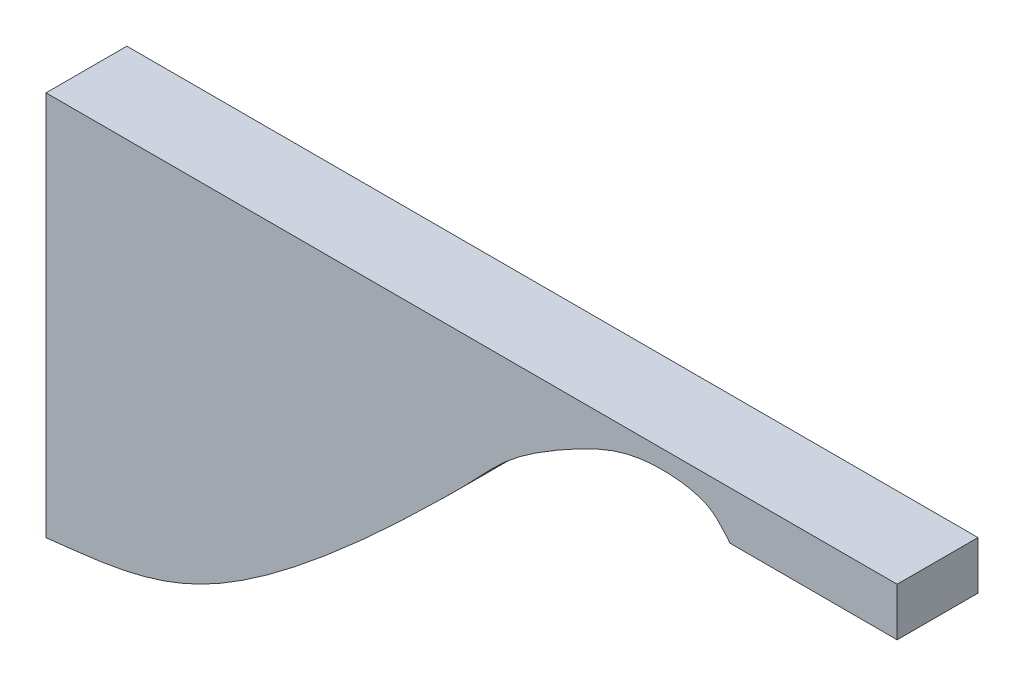
ISO-10303-21;
HEADER;
FILE_DESCRIPTION(('STEP AP214'),'2;1');
FILE_NAME('part.step','',(''),(''),'','','');
FILE_SCHEMA(('AUTOMOTIVE_DESIGN { 1 0 10303 214 1 1 1 1 }'));
ENDSEC;
DATA;
#1=APPLICATION_CONTEXT('core data for automotive mechanical design processes');
#2=APPLICATION_PROTOCOL_DEFINITION('international standard','automotive_design',2000,#1);
#3=PRODUCT_CONTEXT('',#1,'mechanical');
#4=PRODUCT('Part','Part','',(#3));
#5=PRODUCT_RELATED_PRODUCT_CATEGORY('part','',(#4));
#6=PRODUCT_DEFINITION_FORMATION('','',#4);
#7=PRODUCT_DEFINITION_CONTEXT('part definition',#1,'design');
#8=PRODUCT_DEFINITION('design','',#6,#7);
#9=PRODUCT_DEFINITION_SHAPE('','',#8);
#10=(LENGTH_UNIT() NAMED_UNIT(*) SI_UNIT(.MILLI.,.METRE.));
#11=(NAMED_UNIT(*) PLANE_ANGLE_UNIT() SI_UNIT($,.RADIAN.));
#12=(NAMED_UNIT(*) SI_UNIT($,.STERADIAN.) SOLID_ANGLE_UNIT());
#13=UNCERTAINTY_MEASURE_WITH_UNIT(LENGTH_MEASURE(1.E-05),#10,'distance_accuracy_value','');
#14=(GEOMETRIC_REPRESENTATION_CONTEXT(3) GLOBAL_UNCERTAINTY_ASSIGNED_CONTEXT((#13)) GLOBAL_UNIT_ASSIGNED_CONTEXT((#10,
#11,#12)) REPRESENTATION_CONTEXT('',''));
#15=CARTESIAN_POINT('',(0.,0.,0.));
#16=DIRECTION('',(0.,0.,1.));
#17=DIRECTION('',(1.,0.,0.));
#18=AXIS2_PLACEMENT_3D('',#15,#16,#17);
#19=CARTESIAN_POINT('',(32.3540093546962,-35.8630234783665,67.9999999999997));
#20=CARTESIAN_POINT('',(32.6330788083493,-35.831174871455,67.9999999999997));
#21=CARTESIAN_POINT('',(33.2024338177118,-35.7661976278013,67.9999999999997));
#22=CARTESIAN_POINT('',(34.1969972226958,-35.6557091477707,67.9999999999997));
#23=CARTESIAN_POINT('',(35.4101941899744,-35.5193217190211,67.9999999999997));
#24=CARTESIAN_POINT('',(36.7926440722978,-35.3496312045826,67.9999999999997));
#25=CARTESIAN_POINT('',(38.2076962127767,-35.1467983323149,67.9999999999997));
#26=CARTESIAN_POINT('',(40.0387210193549,-34.8311247311899,67.9999999999997));
#27=CARTESIAN_POINT('',(42.2959361043447,-34.3129106992321,67.9999999999997));
#28=CARTESIAN_POINT('',(44.9212362035922,-33.4463756729505,67.9999999999997));
#29=CARTESIAN_POINT('',(47.4363913704997,-32.3443886947765,67.9999999999997));
#30=CARTESIAN_POINT('',(49.8462344698793,-31.0379045520908,67.9999999999997));
#31=CARTESIAN_POINT('',(52.1560834937112,-29.5821742950078,67.9999999999997));
#32=CARTESIAN_POINT('',(54.4170811616657,-28.0016088025287,67.9999999999997));
#33=CARTESIAN_POINT('',(57.3541623503401,-25.7813889640924,67.9999999999997));
#34=CARTESIAN_POINT('',(60.1984612541711,-23.430639248872,67.9999999999997));
#35=CARTESIAN_POINT('',(62.966240857621,-21.0087794511527,67.9999999999997));
#36=CARTESIAN_POINT('',(65.0071125633624,-19.1660369561878,67.9999999999997));
#37=CARTESIAN_POINT('',(67.0365484254392,-17.2801791461122,67.9999999999997));
#38=CARTESIAN_POINT('',(69.03182476144,-15.3712717312916,67.9999999999997));
#39=CARTESIAN_POINT('',(71.021184889787,-13.4418905516791,67.9999999999997));
#40=CARTESIAN_POINT('',(72.6679178960584,-11.8329563479162,67.9999999999997));
#41=CARTESIAN_POINT('',(73.9612727588844,-10.5208625079269,67.9999999999997));
#42=CARTESIAN_POINT('',(74.9035605728542,-9.53031470449987,67.9999999999997));
#43=CARTESIAN_POINT('',(75.8538839536606,-8.52640072737692,67.9999999999997));
#44=CARTESIAN_POINT('',(76.6732912215049,-7.68804763837543,67.9999999999997));
#45=CARTESIAN_POINT('',(77.3502105223689,-7.04120652092875,67.9999999999997));
#46=CARTESIAN_POINT('',(78.0354664903441,-6.42512091462778,67.9999999999997));
#47=CARTESIAN_POINT('',(78.9238164469703,-5.69509336939214,67.9999999999997));
#48=CARTESIAN_POINT('',(80.0467450779227,-4.87640517862623,67.9999999999997));
#49=CARTESIAN_POINT('',(81.3364451474388,-4.02326055158592,67.9999999999997));
#50=CARTESIAN_POINT('',(82.7750912594846,-3.15004285022151,67.9999999999997));
#51=CARTESIAN_POINT('',(84.386632159972,-2.24462673113071,67.9999999999997));
#52=CARTESIAN_POINT('',(85.8846640770158,-1.45990627296777,67.9999999999997));
#53=CARTESIAN_POINT('',(87.2841469350776,-0.811197601278614,67.9999999999997));
#54=CARTESIAN_POINT('',(88.5812694211237,-0.305728618799373,67.9999999999997));
#55=CARTESIAN_POINT('',(89.9243802819226,0.0916516728265372,67.9999999999997));
#56=CARTESIAN_POINT('',(91.1143825343071,0.311124580142114,67.9999999999997));
#57=CARTESIAN_POINT('',(92.1241278614429,0.415695991877606,67.9999999999997));
#58=CARTESIAN_POINT('',(92.9382153298967,0.455613974252438,67.9999999999997));
#59=CARTESIAN_POINT('',(93.7429097870796,0.453297479520632,67.9999999999997));
#60=CARTESIAN_POINT('',(94.5365708340846,0.408636310179086,67.9999999999997));
#61=CARTESIAN_POINT('',(95.320021490409,0.324659160071671,67.9999999999997));
#62=CARTESIAN_POINT('',(96.0934132593756,0.190158561955534,67.9999999999997));
#63=CARTESIAN_POINT('',(96.8207834786106,0.00428318990998316,67.9999999999997));
#64=CARTESIAN_POINT('',(97.510345902275,-0.236191293290041,67.9999999999997));
#65=CARTESIAN_POINT('',(98.1370772670574,-0.555242137012808,67.9999999999997));
#66=CARTESIAN_POINT('',(98.6935906218049,-1.00613569548084,67.9999999999997));
#67=CARTESIAN_POINT('',(99.1012690708429,-1.43365584187039,67.9999999999997));
#68=CARTESIAN_POINT('',(99.4267309800848,-1.7823380343876,67.9999999999997));
#69=CARTESIAN_POINT('',(99.6321694139895,-1.99538293522424,67.9999999999997));
#70=CARTESIAN_POINT('',(99.7878622215634,-2.17292037917236,67.9999999999997));
#71=CARTESIAN_POINT('',(99.8691881318388,-2.28337421914194,67.9999999999997));
#72=CARTESIAN_POINT('',(99.9209199816497,-2.36880614650963,67.9999999999997));
#73=CARTESIAN_POINT('',(99.95338177483,-2.42843950341496,67.9999999999997));
#74=CARTESIAN_POINT('',(99.9732001520754,-2.47375774672997,67.9999999999997));
#75=CARTESIAN_POINT('',(99.983975722447,-2.49839800430064,67.9999999999997));
#76=B_SPLINE_CURVE_WITH_KNOTS('',3,(#19,#20,#21,#22,#23,#24,#25,#26,#27,#28,#29,#30,#31,#32,#33,
#34,#35,#36,#37,#38,#39,#40,#41,#42,#43,#44,#45,#46,#47,#48,#49,#50,#51,#52,#53,#54,#55,#56,#57,
#58,#59,#60,#61,#62,#63,#64,#65,#66,#67,#68,#69,#70,#71,#72,#73,#74,#75),.UNSPECIFIED.,.F.,.F.,
(4,1,1,1,1,1,1,1,1,1,1,1,1,1,1,1,1,1,1,1,1,1,1,1,1,1,1,1,1,1,1,1,1,1,1,1,1,1,1,1,1,1,1,1,1,1,1,
1,1,1,1,1,1,1,4),(0.,0.0104630543131786,0.0213466300537665,0.0372762679664779,
0.0559402708540373,0.0732287281058599,0.0905209560265019,0.125146748241094,0.159389565931452,
0.193347681398195,0.227297442130685,0.261406424322627,0.29500142264721,0.330032122081084,
0.398533667286819,0.432395164321901,0.467031159981195,0.500957742173509,0.535591207387902,
0.56989130907834,0.604191768196869,0.621348974729671,0.638518069042374,0.655117707663771,
0.672844909940174,0.682179127730149,0.689989602409085,0.707167350189343,0.724983204796172,
0.741732072715936,0.764757129666295,0.787655967866948,0.810581867911294,0.82773458156613,
0.845091415397623,0.862394763474605,0.879830438222952,0.890078305891296,0.900193392667756,
0.910177836197095,0.920040045118966,0.929792124611949,0.93951373117875,0.949257042698168,
0.957723954174119,0.966685018233115,0.975292656130332,0.984256317508109,0.988679945674451,
0.993062022145114,0.995278893326172,0.997473267065414,0.998158332990454,0.99899865603441,1.),.UNSPECIFIED.);
#77=DIRECTION('',(0.,0.,1.));
#78=VECTOR('',#77,1.);
#79=SURFACE_OF_LINEAR_EXTRUSION('',#76,#78);
#80=CARTESIAN_POINT('',(99.983975722447,-2.49839800430064,75.9999999999997));
#81=CARTESIAN_POINT('',(99.9732001520754,-2.47375774672997,75.9999999999997));
#82=CARTESIAN_POINT('',(99.95338177483,-2.42843950341496,75.9999999999997));
#83=CARTESIAN_POINT('',(99.9209199816497,-2.36880614650963,75.9999999999997));
#84=CARTESIAN_POINT('',(99.8691881318388,-2.28337421914194,75.9999999999997));
#85=CARTESIAN_POINT('',(99.7878622215634,-2.17292037917236,75.9999999999997));
#86=CARTESIAN_POINT('',(99.6321694139895,-1.99538293522424,75.9999999999997));
#87=CARTESIAN_POINT('',(99.4267309800848,-1.7823380343876,75.9999999999997));
#88=CARTESIAN_POINT('',(99.1012690708429,-1.43365584187039,75.9999999999997));
#89=CARTESIAN_POINT('',(98.6935906218049,-1.00613569548084,75.9999999999997));
#90=CARTESIAN_POINT('',(98.1370772670574,-0.555242137012808,75.9999999999997));
#91=CARTESIAN_POINT('',(97.510345902275,-0.236191293290041,75.9999999999997));
#92=CARTESIAN_POINT('',(96.8207834786106,0.00428318990998316,75.9999999999997));
#93=CARTESIAN_POINT('',(96.0934132593756,0.190158561955534,75.9999999999997));
#94=CARTESIAN_POINT('',(95.320021490409,0.324659160071671,75.9999999999997));
#95=CARTESIAN_POINT('',(94.5365708340846,0.408636310179086,75.9999999999997));
#96=CARTESIAN_POINT('',(93.7429097870796,0.453297479520632,75.9999999999997));
#97=CARTESIAN_POINT('',(92.9382153298967,0.455613974252438,75.9999999999997));
#98=CARTESIAN_POINT('',(92.1241278614429,0.415695991877606,75.9999999999997));
#99=CARTESIAN_POINT('',(91.1143825343071,0.311124580142114,75.9999999999997));
#100=CARTESIAN_POINT('',(89.9243802819226,0.0916516728265372,75.9999999999997));
#101=CARTESIAN_POINT('',(88.5812694211237,-0.305728618799373,75.9999999999997));
#102=CARTESIAN_POINT('',(87.2841469350776,-0.811197601278614,75.9999999999997));
#103=CARTESIAN_POINT('',(85.8846640770158,-1.45990627296777,75.9999999999997));
#104=CARTESIAN_POINT('',(84.386632159972,-2.24462673113071,75.9999999999997));
#105=CARTESIAN_POINT('',(82.7750912594846,-3.15004285022151,75.9999999999997));
#106=CARTESIAN_POINT('',(81.3364451474388,-4.02326055158592,75.9999999999997));
#107=CARTESIAN_POINT('',(80.0467450779227,-4.87640517862623,75.9999999999997));
#108=CARTESIAN_POINT('',(78.9238164469703,-5.69509336939214,75.9999999999997));
#109=CARTESIAN_POINT('',(78.0354664903441,-6.42512091462778,75.9999999999997));
#110=CARTESIAN_POINT('',(77.3502105223689,-7.04120652092875,75.9999999999997));
#111=CARTESIAN_POINT('',(76.6732912215049,-7.68804763837543,75.9999999999997));
#112=CARTESIAN_POINT('',(75.8538839536606,-8.52640072737692,75.9999999999997));
#113=CARTESIAN_POINT('',(74.9035605728542,-9.53031470449987,75.9999999999997));
#114=CARTESIAN_POINT('',(73.9612727588844,-10.5208625079269,75.9999999999997));
#115=CARTESIAN_POINT('',(72.6679178960584,-11.8329563479162,75.9999999999997));
#116=CARTESIAN_POINT('',(71.021184889787,-13.4418905516791,75.9999999999997));
#117=CARTESIAN_POINT('',(69.03182476144,-15.3712717312916,75.9999999999997));
#118=CARTESIAN_POINT('',(67.0365484254392,-17.2801791461122,75.9999999999997));
#119=CARTESIAN_POINT('',(65.0071125633624,-19.1660369561878,75.9999999999997));
#120=CARTESIAN_POINT('',(62.966240857621,-21.0087794511527,75.9999999999997));
#121=CARTESIAN_POINT('',(60.1984612541711,-23.430639248872,75.9999999999997));
#122=CARTESIAN_POINT('',(57.3541623503401,-25.7813889640924,75.9999999999997));
#123=CARTESIAN_POINT('',(54.4170811616657,-28.0016088025287,75.9999999999997));
#124=CARTESIAN_POINT('',(52.1560834937112,-29.5821742950078,75.9999999999997));
#125=CARTESIAN_POINT('',(49.8462344698793,-31.0379045520908,75.9999999999997));
#126=CARTESIAN_POINT('',(47.4363913704997,-32.3443886947765,75.9999999999997));
#127=CARTESIAN_POINT('',(44.9212362035922,-33.4463756729505,75.9999999999997));
#128=CARTESIAN_POINT('',(42.2959361043447,-34.3129106992321,75.9999999999997));
#129=CARTESIAN_POINT('',(40.0387210193549,-34.8311247311899,75.9999999999997));
#130=CARTESIAN_POINT('',(38.2076962127767,-35.1467983323149,75.9999999999997));
#131=CARTESIAN_POINT('',(36.7926440722978,-35.3496312045826,75.9999999999997));
#132=CARTESIAN_POINT('',(35.4101941899744,-35.5193217190211,75.9999999999997));
#133=CARTESIAN_POINT('',(34.1969972226958,-35.6557091477707,75.9999999999997));
#134=CARTESIAN_POINT('',(33.2024338177118,-35.7661976278013,75.9999999999997));
#135=CARTESIAN_POINT('',(32.6330788083493,-35.831174871455,75.9999999999997));
#136=CARTESIAN_POINT('',(32.3540093546962,-35.8630234783665,75.9999999999997));
#137=B_SPLINE_CURVE_WITH_KNOTS('',3,(#80,#81,#82,#83,#84,#85,#86,#87,#88,#89,#90,#91,#92,#93,
#94,#95,#96,#97,#98,#99,#100,#101,#102,#103,#104,#105,#106,#107,#108,#109,#110,#111,#112,#113,
#114,#115,#116,#117,#118,#119,#120,#121,#122,#123,#124,#125,#126,#127,#128,#129,#130,#131,#132,
#133,#134,#135,#136),.UNSPECIFIED.,.F.,.F.,(4,1,1,1,1,1,1,1,1,1,1,1,1,1,1,1,1,1,1,1,1,1,1,1,1,1,
1,1,1,1,1,1,1,1,1,1,1,1,1,1,1,1,1,1,1,1,1,1,1,1,1,1,1,1,4),(0.,0.00100134396558982,
0.0018416670095458,0.00252673293458627,0.00472110667382808,0.00693797785488637,
0.0113200543255492,0.0157436824918914,0.0247073438696677,0.0333149817668854,0.0422760458258814,
0.0507429573018321,0.0604862688212502,0.0702078753880508,0.0799599548810344,0.089822163802905,
0.0998066073322444,0.109921694108704,0.120169561777048,0.137605236525395,0.154908584602377,
0.17226541843387,0.189418132088706,0.212344032133052,0.235242870333705,0.258267927284064,
0.275016795203828,0.292832649810657,0.310010397590915,0.317820872269851,0.327155090059826,
0.344882292336229,0.361481930957626,0.378651025270329,0.395808231803131,0.43010869092166,
0.464408792612098,0.499042257826491,0.532968840018805,0.567604835678099,0.601466332713181,
0.669967877918916,0.70499857735279,0.738593575677373,0.772702557869315,0.806652318601805,
0.840610434068548,0.874853251758906,0.909479043973498,0.92677127189414,0.944059729145963,
0.962723732033522,0.978653369946234,0.989536945686821,1.),.UNSPECIFIED.);
#138=CARTESIAN_POINT('',(32.3540093546963,-35.8630234783665,75.9999999999997));
#139=VERTEX_POINT('',#138);
#140=CARTESIAN_POINT('',(99.983975722447,-2.49839800430064,75.9999999999997));
#141=VERTEX_POINT('',#140);
#142=EDGE_CURVE('E161',#139,#141,#137,.F.);
#143=ORIENTED_EDGE('',*,*,#142,.F.);
#144=DIRECTION('',(0.,0.,1.));
#145=VECTOR('',#144,1.);
#146=CARTESIAN_POINT('',(32.3540093546963,-35.8630234783665,67.9999999999997));
#147=LINE('',#146,#145);
#148=CARTESIAN_POINT('',(32.3540093546963,-35.8630234783665,67.9999999999997));
#149=VERTEX_POINT('',#148);
#150=EDGE_CURVE('E11',#149,#139,#147,.T.);
#151=ORIENTED_EDGE('',*,*,#150,.F.);
#152=CARTESIAN_POINT('',(32.3540093546962,-35.8630234783665,67.9999999999997));
#153=CARTESIAN_POINT('',(32.6330788083493,-35.831174871455,67.9999999999997));
#154=CARTESIAN_POINT('',(33.2024338177118,-35.7661976278013,67.9999999999997));
#155=CARTESIAN_POINT('',(34.1969972226958,-35.6557091477707,67.9999999999997));
#156=CARTESIAN_POINT('',(35.4101941899744,-35.5193217190211,67.9999999999997));
#157=CARTESIAN_POINT('',(36.7926440722978,-35.3496312045826,67.9999999999997));
#158=CARTESIAN_POINT('',(38.2076962127767,-35.1467983323149,67.9999999999997));
#159=CARTESIAN_POINT('',(40.0387210193549,-34.8311247311899,67.9999999999997));
#160=CARTESIAN_POINT('',(42.2959361043447,-34.3129106992321,67.9999999999997));
#161=CARTESIAN_POINT('',(44.9212362035922,-33.4463756729505,67.9999999999997));
#162=CARTESIAN_POINT('',(47.4363913704997,-32.3443886947765,67.9999999999997));
#163=CARTESIAN_POINT('',(49.8462344698793,-31.0379045520908,67.9999999999997));
#164=CARTESIAN_POINT('',(52.1560834937112,-29.5821742950078,67.9999999999997));
#165=CARTESIAN_POINT('',(54.4170811616657,-28.0016088025287,67.9999999999997));
#166=CARTESIAN_POINT('',(57.3541623503401,-25.7813889640924,67.9999999999997));
#167=CARTESIAN_POINT('',(60.1984612541711,-23.430639248872,67.9999999999997));
#168=CARTESIAN_POINT('',(62.966240857621,-21.0087794511527,67.9999999999997));
#169=CARTESIAN_POINT('',(65.0071125633624,-19.1660369561878,67.9999999999997));
#170=CARTESIAN_POINT('',(67.0365484254392,-17.2801791461122,67.9999999999997));
#171=CARTESIAN_POINT('',(69.03182476144,-15.3712717312916,67.9999999999997));
#172=CARTESIAN_POINT('',(71.021184889787,-13.4418905516791,67.9999999999997));
#173=CARTESIAN_POINT('',(72.6679178960584,-11.8329563479162,67.9999999999997));
#174=CARTESIAN_POINT('',(73.9612727588844,-10.5208625079269,67.9999999999997));
#175=CARTESIAN_POINT('',(74.9035605728542,-9.53031470449987,67.9999999999997));
#176=CARTESIAN_POINT('',(75.8538839536606,-8.52640072737692,67.9999999999997));
#177=CARTESIAN_POINT('',(76.6732912215049,-7.68804763837543,67.9999999999997));
#178=CARTESIAN_POINT('',(77.3502105223689,-7.04120652092875,67.9999999999997));
#179=CARTESIAN_POINT('',(78.0354664903441,-6.42512091462778,67.9999999999997));
#180=CARTESIAN_POINT('',(78.9238164469703,-5.69509336939214,67.9999999999997));
#181=CARTESIAN_POINT('',(80.0467450779227,-4.87640517862623,67.9999999999997));
#182=CARTESIAN_POINT('',(81.3364451474388,-4.02326055158592,67.9999999999997));
#183=CARTESIAN_POINT('',(82.7750912594846,-3.15004285022151,67.9999999999997));
#184=CARTESIAN_POINT('',(84.386632159972,-2.24462673113071,67.9999999999997));
#185=CARTESIAN_POINT('',(85.8846640770158,-1.45990627296777,67.9999999999997));
#186=CARTESIAN_POINT('',(87.2841469350776,-0.811197601278614,67.9999999999997));
#187=CARTESIAN_POINT('',(88.5812694211237,-0.305728618799373,67.9999999999997));
#188=CARTESIAN_POINT('',(89.9243802819226,0.0916516728265372,67.9999999999997));
#189=CARTESIAN_POINT('',(91.1143825343071,0.311124580142114,67.9999999999997));
#190=CARTESIAN_POINT('',(92.1241278614429,0.415695991877606,67.9999999999997));
#191=CARTESIAN_POINT('',(92.9382153298967,0.455613974252438,67.9999999999997));
#192=CARTESIAN_POINT('',(93.7429097870796,0.453297479520632,67.9999999999997));
#193=CARTESIAN_POINT('',(94.5365708340846,0.408636310179086,67.9999999999997));
#194=CARTESIAN_POINT('',(95.320021490409,0.324659160071671,67.9999999999997));
#195=CARTESIAN_POINT('',(96.0934132593756,0.190158561955534,67.9999999999997));
#196=CARTESIAN_POINT('',(96.8207834786106,0.00428318990998316,67.9999999999997));
#197=CARTESIAN_POINT('',(97.510345902275,-0.236191293290041,67.9999999999997));
#198=CARTESIAN_POINT('',(98.1370772670574,-0.555242137012808,67.9999999999997));
#199=CARTESIAN_POINT('',(98.6935906218049,-1.00613569548084,67.9999999999997));
#200=CARTESIAN_POINT('',(99.1012690708429,-1.43365584187039,67.9999999999997));
#201=CARTESIAN_POINT('',(99.4267309800848,-1.7823380343876,67.9999999999997));
#202=CARTESIAN_POINT('',(99.6321694139895,-1.99538293522424,67.9999999999997));
#203=CARTESIAN_POINT('',(99.7878622215634,-2.17292037917236,67.9999999999997));
#204=CARTESIAN_POINT('',(99.8691881318388,-2.28337421914194,67.9999999999997));
#205=CARTESIAN_POINT('',(99.9209199816497,-2.36880614650963,67.9999999999997));
#206=CARTESIAN_POINT('',(99.95338177483,-2.42843950341496,67.9999999999997));
#207=CARTESIAN_POINT('',(99.9732001520754,-2.47375774672997,67.9999999999997));
#208=CARTESIAN_POINT('',(99.983975722447,-2.49839800430064,67.9999999999997));
#209=B_SPLINE_CURVE_WITH_KNOTS('',3,(#152,#153,#154,#155,#156,#157,#158,#159,#160,#161,#162,
#163,#164,#165,#166,#167,#168,#169,#170,#171,#172,#173,#174,#175,#176,#177,#178,#179,#180,#181,
#182,#183,#184,#185,#186,#187,#188,#189,#190,#191,#192,#193,#194,#195,#196,#197,#198,#199,#200,
#201,#202,#203,#204,#205,#206,#207,#208),.UNSPECIFIED.,.F.,.F.,(4,1,1,1,1,1,1,1,1,1,1,1,1,1,1,1,
1,1,1,1,1,1,1,1,1,1,1,1,1,1,1,1,1,1,1,1,1,1,1,1,1,1,1,1,1,1,1,1,1,1,1,1,1,1,4),(0.,
0.0104630543131786,0.0213466300537665,0.0372762679664779,0.0559402708540373,0.0732287281058599,
0.0905209560265019,0.125146748241094,0.159389565931452,0.193347681398195,0.227297442130685,
0.261406424322627,0.29500142264721,0.330032122081084,0.398533667286819,0.432395164321901,
0.467031159981195,0.500957742173509,0.535591207387902,0.56989130907834,0.604191768196869,
0.621348974729671,0.638518069042374,0.655117707663771,0.672844909940174,0.682179127730149,
0.689989602409085,0.707167350189343,0.724983204796172,0.741732072715936,0.764757129666295,
0.787655967866948,0.810581867911294,0.82773458156613,0.845091415397623,0.862394763474605,
0.879830438222952,0.890078305891296,0.900193392667756,0.910177836197095,0.920040045118966,
0.929792124611949,0.93951373117875,0.949257042698168,0.957723954174119,0.966685018233115,
0.975292656130332,0.984256317508109,0.988679945674451,0.993062022145114,0.995278893326172,
0.997473267065414,0.998158332990454,0.99899865603441,1.),.UNSPECIFIED.);
#210=CARTESIAN_POINT('',(99.983975722447,-2.49839800430064,67.9999999999997));
#211=VERTEX_POINT('',#210);
#212=EDGE_CURVE('E105',#149,#211,#209,.T.);
#213=ORIENTED_EDGE('',*,*,#212,.T.);
#214=DIRECTION('',(0.,0.,1.));
#215=VECTOR('',#214,1.);
#216=CARTESIAN_POINT('',(99.983975722447,-2.49839800430064,67.9999999999997));
#217=LINE('',#216,#215);
#218=EDGE_CURVE('E79',#211,#141,#217,.T.);
#219=ORIENTED_EDGE('',*,*,#218,.T.);
#220=EDGE_LOOP('',(#143,#151,#213,#219));
#221=FACE_BOUND('',#220,.T.);
#222=ADVANCED_FACE('F30',(#221),#79,.T.);
#223=CARTESIAN_POINT('',(32.3540093546963,-35.8630234783665,67.9999999999997));
#224=DIRECTION('',(-0.99999999994204,1.07665855236451E-05,0.));
#225=DIRECTION('',(-1.07665855236451E-05,-0.99999999994204,0.));
#226=AXIS2_PLACEMENT_3D('',#223,#224,#225);
#227=PLANE('',#226);
#228=DIRECTION('',(-1.07665855236451E-05,-0.99999999994204,0.));
#229=VECTOR('',#228,1.);
#230=CARTESIAN_POINT('',(32.3540093546963,-35.8630234783665,75.9999999999997));
#231=LINE('',#230,#229);
#232=CARTESIAN_POINT('',(32.3544197664226,2.25600000000003,75.9999999999997));
#233=VERTEX_POINT('',#232);
#234=EDGE_CURVE('E115',#233,#139,#231,.T.);
#235=ORIENTED_EDGE('',*,*,#234,.F.);
#236=DIRECTION('',(0.,0.,1.));
#237=VECTOR('',#236,1.);
#238=CARTESIAN_POINT('',(32.3544197664226,2.25600000000003,67.9999999999997));
#239=LINE('',#238,#237);
#240=CARTESIAN_POINT('',(32.3544197664226,2.25600000000003,67.9999999999997));
#241=VERTEX_POINT('',#240);
#242=EDGE_CURVE('E41',#241,#233,#239,.T.);
#243=ORIENTED_EDGE('',*,*,#242,.F.);
#244=DIRECTION('',(-1.07665855236451E-05,-0.99999999994204,0.));
#245=VECTOR('',#244,1.);
#246=CARTESIAN_POINT('',(32.3540093546963,-35.8630234783665,67.9999999999997));
#247=LINE('',#246,#245);
#248=EDGE_CURVE('E100',#241,#149,#247,.T.);
#249=ORIENTED_EDGE('',*,*,#248,.T.);
#250=ORIENTED_EDGE('',*,*,#150,.T.);
#251=EDGE_LOOP('',(#235,#243,#249,#250));
#252=FACE_BOUND('',#251,.T.);
#253=ADVANCED_FACE('F146',(#252),#227,.T.);
#254=CARTESIAN_POINT('',(32.3544197664226,2.25600000000003,67.9999999999997));
#255=DIRECTION('',(0.,1.,0.));
#256=DIRECTION('',(-1.,0.,0.));
#257=AXIS2_PLACEMENT_3D('',#254,#255,#256);
#258=PLANE('',#257);
#259=DIRECTION('',(-1.,0.,0.));
#260=VECTOR('',#259,1.);
#261=CARTESIAN_POINT('',(32.3544197664226,2.25600000000003,75.9999999999997));
#262=LINE('',#261,#260);
#263=CARTESIAN_POINT('',(116.566760896714,2.25600000000004,75.9999999999997));
#264=VERTEX_POINT('',#263);
#265=EDGE_CURVE('E89',#264,#233,#262,.T.);
#266=ORIENTED_EDGE('',*,*,#265,.F.);
#267=DIRECTION('',(0.,0.,1.));
#268=VECTOR('',#267,1.);
#269=CARTESIAN_POINT('',(116.566760896714,2.25600000000004,67.9999999999997));
#270=LINE('',#269,#268);
#271=CARTESIAN_POINT('',(116.566760896714,2.25600000000004,67.9999999999997));
#272=VERTEX_POINT('',#271);
#273=EDGE_CURVE('E84',#272,#264,#270,.T.);
#274=ORIENTED_EDGE('',*,*,#273,.F.);
#275=DIRECTION('',(-1.,0.,0.));
#276=VECTOR('',#275,1.);
#277=CARTESIAN_POINT('',(32.3544197664226,2.25600000000003,67.9999999999997));
#278=LINE('',#277,#276);
#279=EDGE_CURVE('E87',#272,#241,#278,.T.);
#280=ORIENTED_EDGE('',*,*,#279,.T.);
#281=ORIENTED_EDGE('',*,*,#242,.T.);
#282=EDGE_LOOP('',(#266,#274,#280,#281));
#283=FACE_BOUND('',#282,.T.);
#284=ADVANCED_FACE('F86',(#283),#258,.T.);
#285=CARTESIAN_POINT('',(116.566760896714,-2.50932363998967,67.9999999999997));
#286=DIRECTION('',(1.,0.,0.));
#287=DIRECTION('',(0.,1.,0.));
#288=AXIS2_PLACEMENT_3D('',#285,#286,#287);
#289=PLANE('',#288);
#290=DIRECTION('',(0.,1.,0.));
#291=VECTOR('',#290,1.);
#292=CARTESIAN_POINT('',(116.566760896714,-2.50932363998967,75.9999999999997));
#293=LINE('',#292,#291);
#294=CARTESIAN_POINT('',(116.566760896714,-2.50932363998967,75.9999999999997));
#295=VERTEX_POINT('',#294);
#296=EDGE_CURVE('E111',#295,#264,#293,.T.);
#297=ORIENTED_EDGE('',*,*,#296,.F.);
#298=DIRECTION('',(0.,0.,1.));
#299=VECTOR('',#298,1.);
#300=CARTESIAN_POINT('',(116.566760896714,-2.50932363998967,67.9999999999997));
#301=LINE('',#300,#299);
#302=CARTESIAN_POINT('',(116.566760896714,-2.50932363998967,67.9999999999997));
#303=VERTEX_POINT('',#302);
#304=EDGE_CURVE('E94',#303,#295,#301,.T.);
#305=ORIENTED_EDGE('',*,*,#304,.F.);
#306=DIRECTION('',(0.,1.,0.));
#307=VECTOR('',#306,1.);
#308=CARTESIAN_POINT('',(116.566760896714,-2.50932363998967,67.9999999999997));
#309=LINE('',#308,#307);
#310=EDGE_CURVE('E99',#303,#272,#309,.T.);
#311=ORIENTED_EDGE('',*,*,#310,.T.);
#312=ORIENTED_EDGE('',*,*,#273,.T.);
#313=EDGE_LOOP('',(#297,#305,#311,#312));
#314=FACE_BOUND('',#313,.T.);
#315=ADVANCED_FACE('F102',(#314),#289,.T.);
#316=CARTESIAN_POINT('',(99.983975722447,-2.49839800430064,67.9999999999997));
#317=DIRECTION('',(-0.000658853938157022,-0.999999782955721,0.));
#318=DIRECTION('',(0.999999782955721,-0.000658853938157022,0.));
#319=AXIS2_PLACEMENT_3D('',#316,#317,#318);
#320=PLANE('',#319);
#321=DIRECTION('',(0.999999782955721,-0.000658853938157022,0.));
#322=VECTOR('',#321,1.);
#323=CARTESIAN_POINT('',(99.983975722447,-2.49839800430064,75.9999999999997));
#324=LINE('',#323,#322);
#325=EDGE_CURVE('E113',#141,#295,#324,.T.);
#326=ORIENTED_EDGE('',*,*,#325,.F.);
#327=ORIENTED_EDGE('',*,*,#218,.F.);
#328=DIRECTION('',(0.999999782955721,-0.000658853938157022,0.));
#329=VECTOR('',#328,1.);
#330=CARTESIAN_POINT('',(99.983975722447,-2.49839800430064,67.9999999999997));
#331=LINE('',#330,#329);
#332=EDGE_CURVE('E103',#211,#303,#331,.T.);
#333=ORIENTED_EDGE('',*,*,#332,.T.);
#334=ORIENTED_EDGE('',*,*,#304,.T.);
#335=EDGE_LOOP('',(#326,#327,#333,#334));
#336=FACE_BOUND('',#335,.T.);
#337=ADVANCED_FACE('F141',(#336),#320,.T.);
#338=CARTESIAN_POINT('',(66.9620154902221,-17.34123205835,67.9999999999997));
#339=DIRECTION('',(0.,0.,-1.));
#340=DIRECTION('',(-1.,0.,0.));
#341=AXIS2_PLACEMENT_3D('',#338,#339,#340);
#342=PLANE('',#341);
#343=ORIENTED_EDGE('',*,*,#212,.F.);
#344=ORIENTED_EDGE('',*,*,#248,.F.);
#345=ORIENTED_EDGE('',*,*,#279,.F.);
#346=ORIENTED_EDGE('',*,*,#310,.F.);
#347=ORIENTED_EDGE('',*,*,#332,.F.);
#348=EDGE_LOOP('',(#343,#344,#345,#346,#347));
#349=FACE_BOUND('',#348,.T.);
#350=ADVANCED_FACE('F98',(#349),#342,.T.);
#351=CARTESIAN_POINT('',(66.9620154902221,-17.34123205835,75.9999999999997));
#352=DIRECTION('',(0.,0.,-1.));
#353=DIRECTION('',(-1.,0.,0.));
#354=AXIS2_PLACEMENT_3D('',#351,#352,#353);
#355=PLANE('',#354);
#356=ORIENTED_EDGE('',*,*,#142,.T.);
#357=ORIENTED_EDGE('',*,*,#325,.T.);
#358=ORIENTED_EDGE('',*,*,#296,.T.);
#359=ORIENTED_EDGE('',*,*,#265,.T.);
#360=ORIENTED_EDGE('',*,*,#234,.T.);
#361=EDGE_LOOP('',(#356,#357,#358,#359,#360));
#362=FACE_BOUND('',#361,.T.);
#363=ADVANCED_FACE('F140',(#362),#355,.F.);
#364=CLOSED_SHELL('',(#222,#253,#284,#315,#337,#350,#363));
#365=MANIFOLD_SOLID_BREP('B2',#364);
#366=ADVANCED_BREP_SHAPE_REPRESENTATION('',(#18,#365),#14);
#367=SHAPE_DEFINITION_REPRESENTATION(#9,#366);
ENDSEC;
END-ISO-10303-21;
